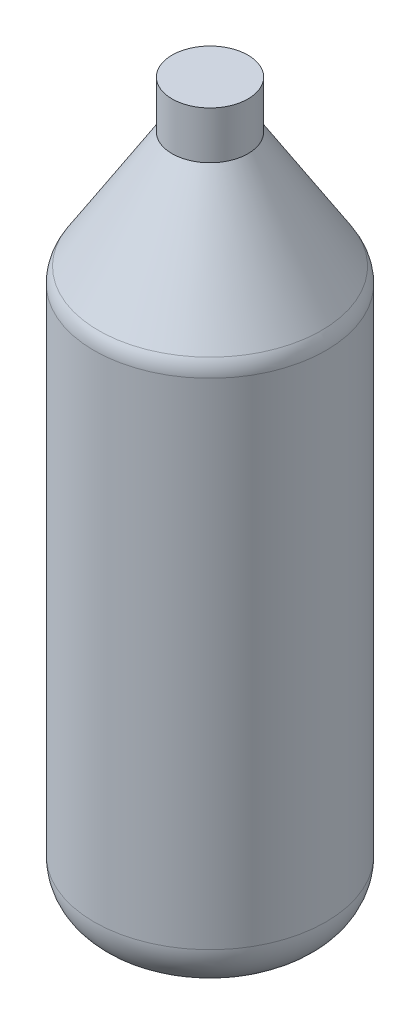
ISO-10303-21;
HEADER;
FILE_DESCRIPTION(('STEP AP214'),'2;1');
FILE_NAME('part.step','',(''),(''),'','','');
FILE_SCHEMA(('AUTOMOTIVE_DESIGN { 1 0 10303 214 1 1 1 1 }'));
ENDSEC;
DATA;
#1=APPLICATION_CONTEXT('core data for automotive mechanical design processes');
#2=APPLICATION_PROTOCOL_DEFINITION('international standard','automotive_design',2000,#1);
#3=PRODUCT_CONTEXT('',#1,'mechanical');
#4=PRODUCT('Part','Part','',(#3));
#5=PRODUCT_RELATED_PRODUCT_CATEGORY('part','',(#4));
#6=PRODUCT_DEFINITION_FORMATION('','',#4);
#7=PRODUCT_DEFINITION_CONTEXT('part definition',#1,'design');
#8=PRODUCT_DEFINITION('design','',#6,#7);
#9=PRODUCT_DEFINITION_SHAPE('','',#8);
#10=(LENGTH_UNIT() NAMED_UNIT(*) SI_UNIT(.MILLI.,.METRE.));
#11=(NAMED_UNIT(*) PLANE_ANGLE_UNIT() SI_UNIT($,.RADIAN.));
#12=(NAMED_UNIT(*) SI_UNIT($,.STERADIAN.) SOLID_ANGLE_UNIT());
#13=UNCERTAINTY_MEASURE_WITH_UNIT(LENGTH_MEASURE(1.E-05),#10,'distance_accuracy_value','');
#14=(GEOMETRIC_REPRESENTATION_CONTEXT(3) GLOBAL_UNCERTAINTY_ASSIGNED_CONTEXT((#13)) GLOBAL_UNIT_ASSIGNED_CONTEXT((#10,
#11,#12)) REPRESENTATION_CONTEXT('',''));
#15=CARTESIAN_POINT('',(0.,0.,0.));
#16=DIRECTION('',(0.,0.,1.));
#17=DIRECTION('',(1.,0.,0.));
#18=AXIS2_PLACEMENT_3D('',#15,#16,#17);
#19=CARTESIAN_POINT('',(0.,147.32,0.));
#20=DIRECTION('',(0.,-1.,0.));
#21=DIRECTION('',(0.,0.,-1.));
#22=AXIS2_PLACEMENT_3D('',#19,#20,#21);
#23=CYLINDRICAL_SURFACE('',#22,30.988);
#24=CARTESIAN_POINT('',(0.,12.7,0.));
#25=DIRECTION('',(0.,1.,0.));
#26=DIRECTION('',(0.,0.,1.));
#27=AXIS2_PLACEMENT_3D('',#24,#25,#26);
#28=CIRCLE('',#27,30.988);
#29=CARTESIAN_POINT('',(0.,12.7,30.988));
#30=VERTEX_POINT('',#29);
#31=EDGE_CURVE('E42',#30,#30,#28,.T.);
#32=ORIENTED_EDGE('',*,*,#31,.T.);
#33=EDGE_LOOP('',(#32));
#34=FACE_BOUND('',#33,.T.);
#35=CARTESIAN_POINT('',(0.,145.117540433841,0.));
#36=DIRECTION('',(0.,-1.,0.));
#37=DIRECTION('',(0.,0.,-1.));
#38=AXIS2_PLACEMENT_3D('',#35,#36,#37);
#39=CIRCLE('',#38,30.988);
#40=CARTESIAN_POINT('',(0.,145.117540433841,-30.988));
#41=VERTEX_POINT('',#40);
#42=EDGE_CURVE('E46',#41,#41,#39,.T.);
#43=ORIENTED_EDGE('',*,*,#42,.T.);
#44=EDGE_LOOP('',(#43));
#45=FACE_BOUND('',#44,.T.);
#46=ADVANCED_FACE('F35',(#34,#45),#23,.T.);
#47=CARTESIAN_POINT('',(0.,0.,0.));
#48=DIRECTION('',(0.,1.,0.));
#49=DIRECTION('',(0.,0.,1.));
#50=AXIS2_PLACEMENT_3D('',#47,#48,#49);
#51=PLANE('',#50);
#52=CARTESIAN_POINT('',(0.,0.,0.));
#53=DIRECTION('',(0.,1.,0.));
#54=DIRECTION('',(0.,0.,1.));
#55=AXIS2_PLACEMENT_3D('',#52,#53,#54);
#56=CIRCLE('',#55,18.288);
#57=CARTESIAN_POINT('',(0.,0.,18.288));
#58=VERTEX_POINT('',#57);
#59=EDGE_CURVE('E11',#58,#58,#56,.F.);
#60=ORIENTED_EDGE('',*,*,#59,.T.);
#61=EDGE_LOOP('',(#60));
#62=FACE_BOUND('',#61,.T.);
#63=ADVANCED_FACE('F75',(#62),#51,.F.);
#64=CARTESIAN_POINT('',(0.,180.34,0.));
#65=DIRECTION('',(0.,-1.,0.));
#66=DIRECTION('',(0.,0.,-1.));
#67=AXIS2_PLACEMENT_3D('',#64,#65,#66);
#68=CONICAL_SURFACE('',#67,10.16,0.562737222761083);
#69=CARTESIAN_POINT('',(0.,149.182835816624,0.));
#70=DIRECTION('',(0.,-1.,0.));
#71=DIRECTION('',(0.,0.,-1.));
#72=AXIS2_PLACEMENT_3D('',#69,#70,#71);
#73=CIRCLE('',#72,29.8129804848989);
#74=CARTESIAN_POINT('',(0.,149.182835816624,-29.8129804848989));
#75=VERTEX_POINT('',#74);
#76=EDGE_CURVE('E50',#75,#75,#73,.F.);
#77=ORIENTED_EDGE('',*,*,#76,.T.);
#78=EDGE_LOOP('',(#77));
#79=FACE_BOUND('',#78,.T.);
#80=CARTESIAN_POINT('',(0.,180.34,0.));
#81=DIRECTION('',(0.,1.,0.));
#82=DIRECTION('',(0.,0.,1.));
#83=AXIS2_PLACEMENT_3D('',#80,#81,#82);
#84=CIRCLE('',#83,10.16);
#85=CARTESIAN_POINT('',(0.,180.34,10.16));
#86=VERTEX_POINT('',#85);
#87=EDGE_CURVE('E94',#86,#86,#84,.T.);
#88=ORIENTED_EDGE('',*,*,#87,.F.);
#89=EDGE_LOOP('',(#88));
#90=FACE_BOUND('',#89,.T.);
#91=ADVANCED_FACE('F71',(#79,#90),#68,.T.);
#92=CARTESIAN_POINT('',(0.,145.117540433841,0.));
#93=DIRECTION('',(0.,-1.,0.));
#94=DIRECTION('',(0.,0.,-1.));
#95=AXIS2_PLACEMENT_3D('',#92,#93,#94);
#96=TOROIDAL_SURFACE('',#95,23.368,7.62);
#97=ORIENTED_EDGE('',*,*,#42,.F.);
#98=EDGE_LOOP('',(#97));
#99=FACE_BOUND('',#98,.T.);
#100=ORIENTED_EDGE('',*,*,#76,.F.);
#101=EDGE_LOOP('',(#100));
#102=FACE_BOUND('',#101,.T.);
#103=ADVANCED_FACE('F69',(#99,#102),#96,.T.);
#104=CARTESIAN_POINT('',(0.,193.04,0.));
#105=DIRECTION('',(0.,-1.,0.));
#106=DIRECTION('',(0.,0.,-1.));
#107=AXIS2_PLACEMENT_3D('',#104,#105,#106);
#108=CYLINDRICAL_SURFACE('',#107,10.16);
#109=CARTESIAN_POINT('',(0.,193.04,0.));
#110=DIRECTION('',(0.,1.,0.));
#111=DIRECTION('',(0.,0.,1.));
#112=AXIS2_PLACEMENT_3D('',#109,#110,#111);
#113=CIRCLE('',#112,10.16);
#114=CARTESIAN_POINT('',(0.,193.04,10.16));
#115=VERTEX_POINT('',#114);
#116=EDGE_CURVE('E91',#115,#115,#113,.T.);
#117=ORIENTED_EDGE('',*,*,#116,.F.);
#118=EDGE_LOOP('',(#117));
#119=FACE_BOUND('',#118,.T.);
#120=ORIENTED_EDGE('',*,*,#87,.T.);
#121=EDGE_LOOP('',(#120));
#122=FACE_BOUND('',#121,.T.);
#123=ADVANCED_FACE('F58',(#119,#122),#108,.T.);
#124=CARTESIAN_POINT('',(0.,193.04,0.));
#125=DIRECTION('',(0.,1.,0.));
#126=DIRECTION('',(0.,0.,1.));
#127=AXIS2_PLACEMENT_3D('',#124,#125,#126);
#128=PLANE('',#127);
#129=ORIENTED_EDGE('',*,*,#116,.T.);
#130=EDGE_LOOP('',(#129));
#131=FACE_BOUND('',#130,.T.);
#132=ADVANCED_FACE('F68',(#131),#128,.T.);
#133=CARTESIAN_POINT('',(0.,12.7,0.));
#134=DIRECTION('',(0.,1.,0.));
#135=DIRECTION('',(0.,0.,1.));
#136=AXIS2_PLACEMENT_3D('',#133,#134,#135);
#137=TOROIDAL_SURFACE('',#136,18.288,12.7);
#138=ORIENTED_EDGE('',*,*,#59,.F.);
#139=EDGE_LOOP('',(#138));
#140=FACE_BOUND('',#139,.T.);
#141=ORIENTED_EDGE('',*,*,#31,.F.);
#142=EDGE_LOOP('',(#141));
#143=FACE_BOUND('',#142,.T.);
#144=ADVANCED_FACE('F37',(#140,#143),#137,.T.);
#145=CLOSED_SHELL('',(#46,#63,#91,#103,#123,#132,#144));
#146=MANIFOLD_SOLID_BREP('B2',#145);
#147=ADVANCED_BREP_SHAPE_REPRESENTATION('',(#18,#146),#14);
#148=SHAPE_DEFINITION_REPRESENTATION(#9,#147);
ENDSEC;
END-ISO-10303-21;
